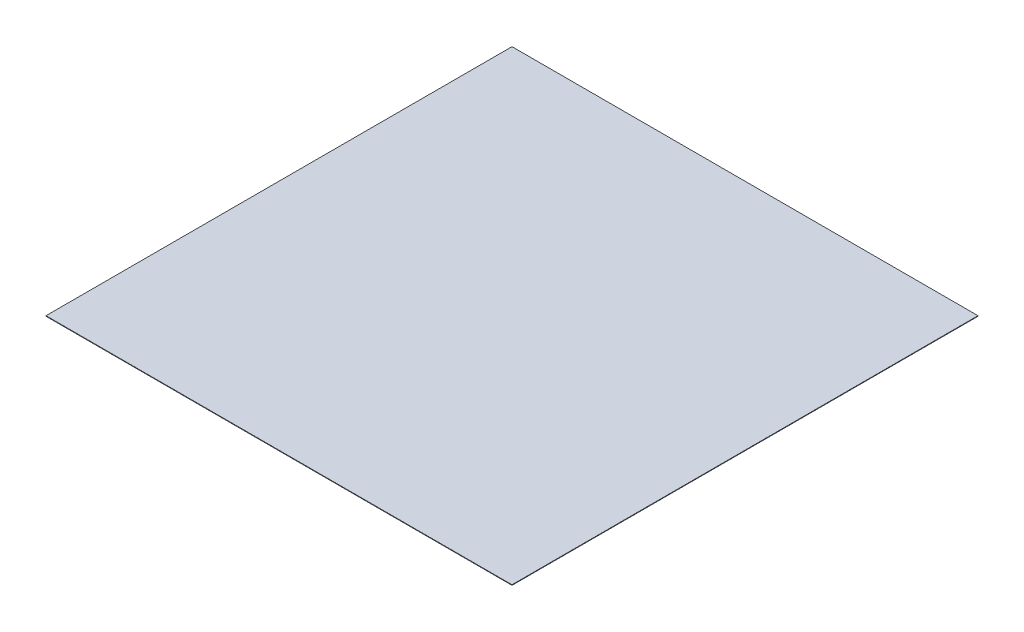
ISO-10303-21;
HEADER;
FILE_DESCRIPTION(('STEP AP214'),'2;1');
FILE_NAME('part.step','',(''),(''),'','','');
FILE_SCHEMA(('AUTOMOTIVE_DESIGN { 1 0 10303 214 1 1 1 1 }'));
ENDSEC;
DATA;
#1=APPLICATION_CONTEXT('core data for automotive mechanical design processes');
#2=APPLICATION_PROTOCOL_DEFINITION('international standard','automotive_design',2000,#1);
#3=PRODUCT_CONTEXT('',#1,'mechanical');
#4=PRODUCT('Part','Part','',(#3));
#5=PRODUCT_RELATED_PRODUCT_CATEGORY('part','',(#4));
#6=PRODUCT_DEFINITION_FORMATION('','',#4);
#7=PRODUCT_DEFINITION_CONTEXT('part definition',#1,'design');
#8=PRODUCT_DEFINITION('design','',#6,#7);
#9=PRODUCT_DEFINITION_SHAPE('','',#8);
#10=(LENGTH_UNIT() NAMED_UNIT(*) SI_UNIT(.MILLI.,.METRE.));
#11=(NAMED_UNIT(*) PLANE_ANGLE_UNIT() SI_UNIT($,.RADIAN.));
#12=(NAMED_UNIT(*) SI_UNIT($,.STERADIAN.) SOLID_ANGLE_UNIT());
#13=UNCERTAINTY_MEASURE_WITH_UNIT(LENGTH_MEASURE(1.E-05),#10,'distance_accuracy_value','');
#14=(GEOMETRIC_REPRESENTATION_CONTEXT(3) GLOBAL_UNCERTAINTY_ASSIGNED_CONTEXT((#13)) GLOBAL_UNIT_ASSIGNED_CONTEXT((#10,
#11,#12)) REPRESENTATION_CONTEXT('',''));
#15=CARTESIAN_POINT('',(0.,0.,0.));
#16=DIRECTION('',(0.,0.,1.));
#17=DIRECTION('',(1.,0.,0.));
#18=AXIS2_PLACEMENT_3D('',#15,#16,#17);
#19=CARTESIAN_POINT('',(4500.,10.,4500.));
#20=DIRECTION('',(-1.,0.,0.));
#21=DIRECTION('',(0.,0.,1.));
#22=AXIS2_PLACEMENT_3D('',#19,#20,#21);
#23=PLANE('',#22);
#24=DIRECTION('',(0.,0.,-1.));
#25=VECTOR('',#24,1.);
#26=CARTESIAN_POINT('',(4500.,0.,4500.));
#27=LINE('',#26,#25);
#28=CARTESIAN_POINT('',(4500.,0.,4500.));
#29=VERTEX_POINT('',#28);
#30=CARTESIAN_POINT('',(4500.,0.,-4500.));
#31=VERTEX_POINT('',#30);
#32=EDGE_CURVE('E107',#29,#31,#27,.T.);
#33=ORIENTED_EDGE('',*,*,#32,.T.);
#34=DIRECTION('',(0.,-1.,0.));
#35=VECTOR('',#34,1.);
#36=CARTESIAN_POINT('',(4500.,10.,-4500.));
#37=LINE('',#36,#35);
#38=CARTESIAN_POINT('',(4500.,10.,-4500.));
#39=VERTEX_POINT('',#38);
#40=EDGE_CURVE('E11',#39,#31,#37,.T.);
#41=ORIENTED_EDGE('',*,*,#40,.F.);
#42=DIRECTION('',(0.,0.,-1.));
#43=VECTOR('',#42,1.);
#44=CARTESIAN_POINT('',(4500.,10.,4500.));
#45=LINE('',#44,#43);
#46=CARTESIAN_POINT('',(4500.,10.,4500.));
#47=VERTEX_POINT('',#46);
#48=EDGE_CURVE('E91',#47,#39,#45,.T.);
#49=ORIENTED_EDGE('',*,*,#48,.F.);
#50=DIRECTION('',(0.,-1.,0.));
#51=VECTOR('',#50,1.);
#52=CARTESIAN_POINT('',(4500.,10.,4500.));
#53=LINE('',#52,#51);
#54=EDGE_CURVE('E103',#47,#29,#53,.T.);
#55=ORIENTED_EDGE('',*,*,#54,.T.);
#56=EDGE_LOOP('',(#33,#41,#49,#55));
#57=FACE_BOUND('',#56,.T.);
#58=ADVANCED_FACE('F39',(#57),#23,.F.);
#59=CARTESIAN_POINT('',(-4500.,10.,-4500.));
#60=DIRECTION('',(0.,0.,1.));
#61=DIRECTION('',(1.,0.,0.));
#62=AXIS2_PLACEMENT_3D('',#59,#60,#61);
#63=PLANE('',#62);
#64=DIRECTION('',(-1.,0.,0.));
#65=VECTOR('',#64,1.);
#66=CARTESIAN_POINT('',(-4500.,0.,-4500.));
#67=LINE('',#66,#65);
#68=CARTESIAN_POINT('',(-4500.,0.,-4500.));
#69=VERTEX_POINT('',#68);
#70=EDGE_CURVE('E96',#31,#69,#67,.T.);
#71=ORIENTED_EDGE('',*,*,#70,.T.);
#72=DIRECTION('',(0.,-1.,0.));
#73=VECTOR('',#72,1.);
#74=CARTESIAN_POINT('',(-4500.,10.,-4500.));
#75=LINE('',#74,#73);
#76=CARTESIAN_POINT('',(-4500.,10.,-4500.));
#77=VERTEX_POINT('',#76);
#78=EDGE_CURVE('E48',#77,#69,#75,.T.);
#79=ORIENTED_EDGE('',*,*,#78,.F.);
#80=DIRECTION('',(-1.,0.,0.));
#81=VECTOR('',#80,1.);
#82=CARTESIAN_POINT('',(-4500.,10.,-4500.));
#83=LINE('',#82,#81);
#84=EDGE_CURVE('E86',#39,#77,#83,.T.);
#85=ORIENTED_EDGE('',*,*,#84,.F.);
#86=ORIENTED_EDGE('',*,*,#40,.T.);
#87=EDGE_LOOP('',(#71,#79,#85,#86));
#88=FACE_BOUND('',#87,.T.);
#89=ADVANCED_FACE('F95',(#88),#63,.F.);
#90=CARTESIAN_POINT('',(-4500.,10.,4500.));
#91=DIRECTION('',(1.,0.,0.));
#92=DIRECTION('',(0.,0.,-1.));
#93=AXIS2_PLACEMENT_3D('',#90,#91,#92);
#94=PLANE('',#93);
#95=DIRECTION('',(0.,0.,1.));
#96=VECTOR('',#95,1.);
#97=CARTESIAN_POINT('',(-4500.,0.,4500.));
#98=LINE('',#97,#96);
#99=CARTESIAN_POINT('',(-4500.,0.,4500.));
#100=VERTEX_POINT('',#99);
#101=EDGE_CURVE('E73',#69,#100,#98,.T.);
#102=ORIENTED_EDGE('',*,*,#101,.T.);
#103=DIRECTION('',(0.,-1.,0.));
#104=VECTOR('',#103,1.);
#105=CARTESIAN_POINT('',(-4500.,10.,4500.));
#106=LINE('',#105,#104);
#107=CARTESIAN_POINT('',(-4500.,10.,4500.));
#108=VERTEX_POINT('',#107);
#109=EDGE_CURVE('E98',#108,#100,#106,.T.);
#110=ORIENTED_EDGE('',*,*,#109,.F.);
#111=DIRECTION('',(0.,0.,1.));
#112=VECTOR('',#111,1.);
#113=CARTESIAN_POINT('',(-4500.,10.,4500.));
#114=LINE('',#113,#112);
#115=EDGE_CURVE('E89',#77,#108,#114,.T.);
#116=ORIENTED_EDGE('',*,*,#115,.F.);
#117=ORIENTED_EDGE('',*,*,#78,.T.);
#118=EDGE_LOOP('',(#102,#110,#116,#117));
#119=FACE_BOUND('',#118,.T.);
#120=ADVANCED_FACE('F99',(#119),#94,.F.);
#121=CARTESIAN_POINT('',(-4500.,10.,4500.));
#122=DIRECTION('',(0.,0.,-1.));
#123=DIRECTION('',(-1.,0.,0.));
#124=AXIS2_PLACEMENT_3D('',#121,#122,#123);
#125=PLANE('',#124);
#126=DIRECTION('',(1.,0.,0.));
#127=VECTOR('',#126,1.);
#128=CARTESIAN_POINT('',(-4500.,0.,4500.));
#129=LINE('',#128,#127);
#130=EDGE_CURVE('E79',#100,#29,#129,.T.);
#131=ORIENTED_EDGE('',*,*,#130,.T.);
#132=ORIENTED_EDGE('',*,*,#54,.F.);
#133=DIRECTION('',(1.,0.,0.));
#134=VECTOR('',#133,1.);
#135=CARTESIAN_POINT('',(-4500.,10.,4500.));
#136=LINE('',#135,#134);
#137=EDGE_CURVE('E56',#108,#47,#136,.T.);
#138=ORIENTED_EDGE('',*,*,#137,.F.);
#139=ORIENTED_EDGE('',*,*,#109,.T.);
#140=EDGE_LOOP('',(#131,#132,#138,#139));
#141=FACE_BOUND('',#140,.T.);
#142=ADVANCED_FACE('F120',(#141),#125,.F.);
#143=CARTESIAN_POINT('',(0.,10.,0.));
#144=DIRECTION('',(0.,-1.,0.));
#145=DIRECTION('',(0.,0.,-1.));
#146=AXIS2_PLACEMENT_3D('',#143,#144,#145);
#147=PLANE('',#146);
#148=ORIENTED_EDGE('',*,*,#48,.T.);
#149=ORIENTED_EDGE('',*,*,#84,.T.);
#150=ORIENTED_EDGE('',*,*,#115,.T.);
#151=ORIENTED_EDGE('',*,*,#137,.T.);
#152=EDGE_LOOP('',(#148,#149,#150,#151));
#153=FACE_BOUND('',#152,.T.);
#154=ADVANCED_FACE('F87',(#153),#147,.F.);
#155=CARTESIAN_POINT('',(0.,0.,0.));
#156=DIRECTION('',(0.,-1.,0.));
#157=DIRECTION('',(0.,0.,-1.));
#158=AXIS2_PLACEMENT_3D('',#155,#156,#157);
#159=PLANE('',#158);
#160=ORIENTED_EDGE('',*,*,#32,.F.);
#161=ORIENTED_EDGE('',*,*,#130,.F.);
#162=ORIENTED_EDGE('',*,*,#101,.F.);
#163=ORIENTED_EDGE('',*,*,#70,.F.);
#164=EDGE_LOOP('',(#160,#161,#162,#163));
#165=FACE_BOUND('',#164,.T.);
#166=ADVANCED_FACE('F123',(#165),#159,.T.);
#167=CLOSED_SHELL('',(#58,#89,#120,#142,#154,#166));
#168=MANIFOLD_SOLID_BREP('B2',#167);
#169=ADVANCED_BREP_SHAPE_REPRESENTATION('',(#18,#168),#14);
#170=SHAPE_DEFINITION_REPRESENTATION(#9,#169);
ENDSEC;
END-ISO-10303-21;
